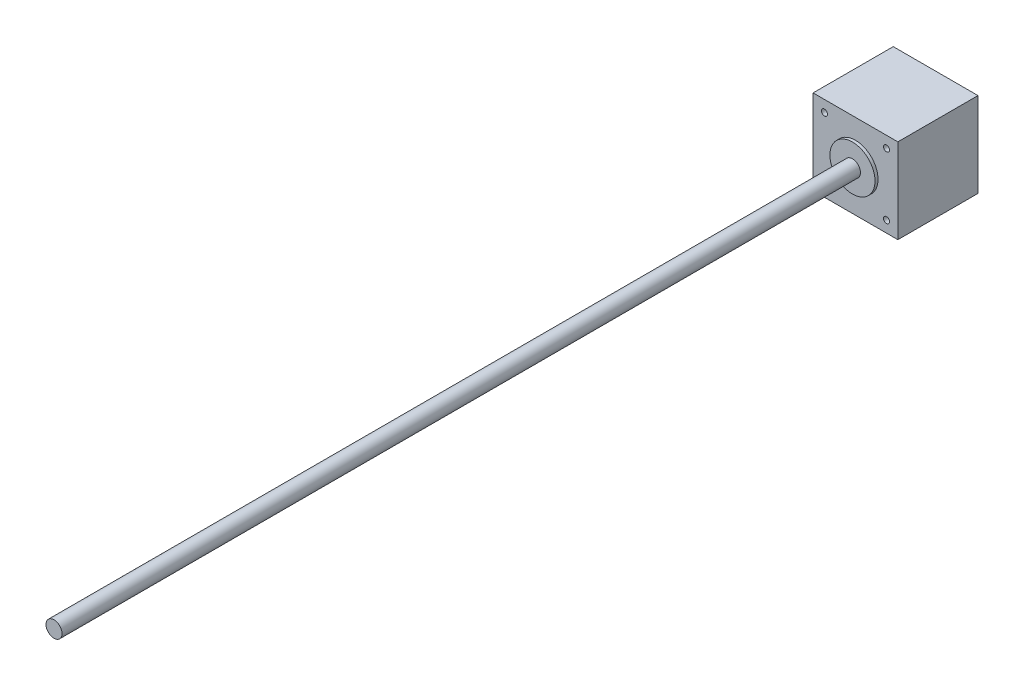
ISO-10303-21;
HEADER;
FILE_DESCRIPTION(('STEP AP214'),'2;1');
FILE_NAME('part.step','',(''),(''),'','','');
FILE_SCHEMA(('AUTOMOTIVE_DESIGN { 1 0 10303 214 1 1 1 1 }'));
ENDSEC;
DATA;
#1=APPLICATION_CONTEXT('core data for automotive mechanical design processes');
#2=APPLICATION_PROTOCOL_DEFINITION('international standard','automotive_design',2000,#1);
#3=PRODUCT_CONTEXT('',#1,'mechanical');
#4=PRODUCT('Part','Part','',(#3));
#5=PRODUCT_RELATED_PRODUCT_CATEGORY('part','',(#4));
#6=PRODUCT_DEFINITION_FORMATION('','',#4);
#7=PRODUCT_DEFINITION_CONTEXT('part definition',#1,'design');
#8=PRODUCT_DEFINITION('design','',#6,#7);
#9=PRODUCT_DEFINITION_SHAPE('','',#8);
#10=(LENGTH_UNIT() NAMED_UNIT(*) SI_UNIT(.MILLI.,.METRE.));
#11=(NAMED_UNIT(*) PLANE_ANGLE_UNIT() SI_UNIT($,.RADIAN.));
#12=(NAMED_UNIT(*) SI_UNIT($,.STERADIAN.) SOLID_ANGLE_UNIT());
#13=UNCERTAINTY_MEASURE_WITH_UNIT(LENGTH_MEASURE(1.E-05),#10,'distance_accuracy_value','');
#14=(GEOMETRIC_REPRESENTATION_CONTEXT(3) GLOBAL_UNCERTAINTY_ASSIGNED_CONTEXT((#13)) GLOBAL_UNIT_ASSIGNED_CONTEXT((#10,
#11,#12)) REPRESENTATION_CONTEXT('',''));
#15=CARTESIAN_POINT('',(0.,0.,0.));
#16=DIRECTION('',(0.,0.,1.));
#17=DIRECTION('',(1.,0.,0.));
#18=AXIS2_PLACEMENT_3D('',#15,#16,#17);
#19=CARTESIAN_POINT('',(-21.15,-21.15,-40.));
#20=DIRECTION('',(0.,-1.,0.));
#21=DIRECTION('',(0.,0.,-1.));
#22=AXIS2_PLACEMENT_3D('',#19,#20,#21);
#23=PLANE('',#22);
#24=DIRECTION('',(0.,0.,-1.));
#25=VECTOR('',#24,1.);
#26=CARTESIAN_POINT('',(-8.5,-21.15,-40.));
#27=LINE('',#26,#25);
#28=CARTESIAN_POINT('',(-8.5,-21.15,-31.));
#29=VERTEX_POINT('',#28);
#30=CARTESIAN_POINT('',(-8.5,-21.15,-40.));
#31=VERTEX_POINT('',#30);
#32=EDGE_CURVE('E49',#29,#31,#27,.T.);
#33=ORIENTED_EDGE('',*,*,#32,.F.);
#34=DIRECTION('',(-1.,0.,0.));
#35=VECTOR('',#34,1.);
#36=CARTESIAN_POINT('',(-8.5,-21.15,-31.));
#37=LINE('',#36,#35);
#38=CARTESIAN_POINT('',(8.5,-21.15,-31.));
#39=VERTEX_POINT('',#38);
#40=EDGE_CURVE('E117',#39,#29,#37,.T.);
#41=ORIENTED_EDGE('',*,*,#40,.F.);
#42=DIRECTION('',(0.,0.,1.));
#43=VECTOR('',#42,1.);
#44=CARTESIAN_POINT('',(8.50000000000001,-21.15,-40.));
#45=LINE('',#44,#43);
#46=CARTESIAN_POINT('',(8.50000000000001,-21.15,-40.));
#47=VERTEX_POINT('',#46);
#48=EDGE_CURVE('E55',#47,#39,#45,.T.);
#49=ORIENTED_EDGE('',*,*,#48,.F.);
#50=DIRECTION('',(1.,0.,0.));
#51=VECTOR('',#50,1.);
#52=CARTESIAN_POINT('',(-21.15,-21.15,-40.));
#53=LINE('',#52,#51);
#54=CARTESIAN_POINT('',(21.15,-21.15,-40.));
#55=VERTEX_POINT('',#54);
#56=EDGE_CURVE('E165',#47,#55,#53,.T.);
#57=ORIENTED_EDGE('',*,*,#56,.T.);
#58=DIRECTION('',(0.,0.,1.));
#59=VECTOR('',#58,1.);
#60=CARTESIAN_POINT('',(21.15,-21.15,-40.));
#61=LINE('',#60,#59);
#62=CARTESIAN_POINT('',(21.15,-21.15,0.));
#63=VERTEX_POINT('',#62);
#64=EDGE_CURVE('E36',#55,#63,#61,.T.);
#65=ORIENTED_EDGE('',*,*,#64,.T.);
#66=DIRECTION('',(1.,0.,0.));
#67=VECTOR('',#66,1.);
#68=CARTESIAN_POINT('',(-21.15,-21.15,0.));
#69=LINE('',#68,#67);
#70=CARTESIAN_POINT('',(-21.15,-21.15,0.));
#71=VERTEX_POINT('',#70);
#72=EDGE_CURVE('E159',#71,#63,#69,.T.);
#73=ORIENTED_EDGE('',*,*,#72,.F.);
#74=DIRECTION('',(0.,0.,1.));
#75=VECTOR('',#74,1.);
#76=CARTESIAN_POINT('',(-21.15,-21.15,-40.));
#77=LINE('',#76,#75);
#78=CARTESIAN_POINT('',(-21.15,-21.15,-40.));
#79=VERTEX_POINT('',#78);
#80=EDGE_CURVE('E11',#79,#71,#77,.T.);
#81=ORIENTED_EDGE('',*,*,#80,.F.);
#82=EDGE_CURVE('E162',#79,#31,#53,.T.);
#83=ORIENTED_EDGE('',*,*,#82,.T.);
#84=EDGE_LOOP('',(#33,#41,#49,#57,#65,#73,#81,#83));
#85=FACE_BOUND('',#84,.T.);
#86=ADVANCED_FACE('F33',(#85),#23,.T.);
#87=CARTESIAN_POINT('',(-21.15,-21.15,-40.));
#88=DIRECTION('',(1.,0.,0.));
#89=DIRECTION('',(0.,0.,-1.));
#90=AXIS2_PLACEMENT_3D('',#87,#88,#89);
#91=PLANE('',#90);
#92=DIRECTION('',(0.,1.,0.));
#93=VECTOR('',#92,1.);
#94=CARTESIAN_POINT('',(-21.15,-21.15,0.));
#95=LINE('',#94,#93);
#96=CARTESIAN_POINT('',(-21.15,21.15,0.));
#97=VERTEX_POINT('',#96);
#98=EDGE_CURVE('E180',#71,#97,#95,.T.);
#99=ORIENTED_EDGE('',*,*,#98,.T.);
#100=DIRECTION('',(0.,0.,1.));
#101=VECTOR('',#100,1.);
#102=CARTESIAN_POINT('',(-21.15,21.15,-40.));
#103=LINE('',#102,#101);
#104=CARTESIAN_POINT('',(-21.15,21.15,-40.));
#105=VERTEX_POINT('',#104);
#106=EDGE_CURVE('E41',#105,#97,#103,.T.);
#107=ORIENTED_EDGE('',*,*,#106,.F.);
#108=DIRECTION('',(0.,1.,0.));
#109=VECTOR('',#108,1.);
#110=CARTESIAN_POINT('',(-21.15,-21.15,-40.));
#111=LINE('',#110,#109);
#112=EDGE_CURVE('E170',#79,#105,#111,.T.);
#113=ORIENTED_EDGE('',*,*,#112,.F.);
#114=ORIENTED_EDGE('',*,*,#80,.T.);
#115=EDGE_LOOP('',(#99,#107,#113,#114));
#116=FACE_BOUND('',#115,.T.);
#117=ADVANCED_FACE('F197',(#116),#91,.F.);
#118=CARTESIAN_POINT('',(-21.15,21.15,-40.));
#119=DIRECTION('',(0.,-1.,0.));
#120=DIRECTION('',(0.,0.,-1.));
#121=AXIS2_PLACEMENT_3D('',#118,#119,#120);
#122=PLANE('',#121);
#123=DIRECTION('',(1.,0.,0.));
#124=VECTOR('',#123,1.);
#125=CARTESIAN_POINT('',(-21.15,21.15,0.));
#126=LINE('',#125,#124);
#127=CARTESIAN_POINT('',(21.15,21.15,0.));
#128=VERTEX_POINT('',#127);
#129=EDGE_CURVE('E177',#97,#128,#126,.T.);
#130=ORIENTED_EDGE('',*,*,#129,.T.);
#131=DIRECTION('',(0.,0.,1.));
#132=VECTOR('',#131,1.);
#133=CARTESIAN_POINT('',(21.15,21.15,-40.));
#134=LINE('',#133,#132);
#135=CARTESIAN_POINT('',(21.15,21.15,-40.));
#136=VERTEX_POINT('',#135);
#137=EDGE_CURVE('E183',#136,#128,#134,.T.);
#138=ORIENTED_EDGE('',*,*,#137,.F.);
#139=DIRECTION('',(1.,0.,0.));
#140=VECTOR('',#139,1.);
#141=CARTESIAN_POINT('',(-21.15,21.15,-40.));
#142=LINE('',#141,#140);
#143=EDGE_CURVE('E168',#105,#136,#142,.T.);
#144=ORIENTED_EDGE('',*,*,#143,.F.);
#145=ORIENTED_EDGE('',*,*,#106,.T.);
#146=EDGE_LOOP('',(#130,#138,#144,#145));
#147=FACE_BOUND('',#146,.T.);
#148=ADVANCED_FACE('F201',(#147),#122,.F.);
#149=CARTESIAN_POINT('',(21.15,-21.15,-40.));
#150=DIRECTION('',(1.,0.,0.));
#151=DIRECTION('',(0.,0.,-1.));
#152=AXIS2_PLACEMENT_3D('',#149,#150,#151);
#153=PLANE('',#152);
#154=DIRECTION('',(0.,1.,0.));
#155=VECTOR('',#154,1.);
#156=CARTESIAN_POINT('',(21.15,-21.15,0.));
#157=LINE('',#156,#155);
#158=EDGE_CURVE('E174',#63,#128,#157,.T.);
#159=ORIENTED_EDGE('',*,*,#158,.F.);
#160=ORIENTED_EDGE('',*,*,#64,.F.);
#161=DIRECTION('',(0.,1.,0.));
#162=VECTOR('',#161,1.);
#163=CARTESIAN_POINT('',(21.15,-21.15,-40.));
#164=LINE('',#163,#162);
#165=EDGE_CURVE('E164',#55,#136,#164,.T.);
#166=ORIENTED_EDGE('',*,*,#165,.T.);
#167=ORIENTED_EDGE('',*,*,#137,.T.);
#168=EDGE_LOOP('',(#159,#160,#166,#167));
#169=FACE_BOUND('',#168,.T.);
#170=ADVANCED_FACE('F190',(#169),#153,.T.);
#171=CARTESIAN_POINT('',(0.,0.,-40.));
#172=DIRECTION('',(0.,0.,1.));
#173=DIRECTION('',(1.,0.,0.));
#174=AXIS2_PLACEMENT_3D('',#171,#172,#173);
#175=PLANE('',#174);
#176=ORIENTED_EDGE('',*,*,#82,.F.);
#177=ORIENTED_EDGE('',*,*,#112,.T.);
#178=ORIENTED_EDGE('',*,*,#143,.T.);
#179=ORIENTED_EDGE('',*,*,#165,.F.);
#180=ORIENTED_EDGE('',*,*,#56,.F.);
#181=DIRECTION('',(0.,1.,0.));
#182=VECTOR('',#181,1.);
#183=CARTESIAN_POINT('',(8.50000000000001,-26.15,-40.));
#184=LINE('',#183,#182);
#185=CARTESIAN_POINT('',(8.50000000000001,-26.15,-40.));
#186=VERTEX_POINT('',#185);
#187=EDGE_CURVE('E104',#186,#47,#184,.T.);
#188=ORIENTED_EDGE('',*,*,#187,.F.);
#189=DIRECTION('',(1.,0.,0.));
#190=VECTOR('',#189,1.);
#191=CARTESIAN_POINT('',(-8.5,-26.15,-40.));
#192=LINE('',#191,#190);
#193=CARTESIAN_POINT('',(-8.5,-26.15,-40.));
#194=VERTEX_POINT('',#193);
#195=EDGE_CURVE('E97',#194,#186,#192,.T.);
#196=ORIENTED_EDGE('',*,*,#195,.F.);
#197=DIRECTION('',(0.,1.,0.));
#198=VECTOR('',#197,1.);
#199=CARTESIAN_POINT('',(-8.5,-26.15,-40.));
#200=LINE('',#199,#198);
#201=EDGE_CURVE('E102',#194,#31,#200,.T.);
#202=ORIENTED_EDGE('',*,*,#201,.T.);
#203=EDGE_LOOP('',(#176,#177,#178,#179,#180,#188,#196,#202));
#204=FACE_BOUND('',#203,.T.);
#205=ADVANCED_FACE('F100',(#204),#175,.F.);
#206=CARTESIAN_POINT('',(0.,0.,0.));
#207=DIRECTION('',(0.,0.,1.));
#208=DIRECTION('',(1.,0.,0.));
#209=AXIS2_PLACEMENT_3D('',#206,#207,#208);
#210=PLANE('',#209);
#211=CARTESIAN_POINT('',(0.,0.,0.));
#212=DIRECTION('',(0.,0.,1.));
#213=DIRECTION('',(1.,0.,0.));
#214=AXIS2_PLACEMENT_3D('',#211,#212,#213);
#215=CIRCLE('',#214,11.25);
#216=CARTESIAN_POINT('',(11.25,0.,0.));
#217=VERTEX_POINT('',#216);
#218=EDGE_CURVE('E123',#217,#217,#215,.T.);
#219=ORIENTED_EDGE('',*,*,#218,.F.);
#220=EDGE_LOOP('',(#219));
#221=FACE_BOUND('',#220,.T.);
#222=CARTESIAN_POINT('',(-15.5000000000001,15.5,0.));
#223=DIRECTION('',(0.,0.,1.));
#224=DIRECTION('',(1.,0.,0.));
#225=AXIS2_PLACEMENT_3D('',#222,#223,#224);
#226=CIRCLE('',#225,1.5);
#227=CARTESIAN_POINT('',(-14.0000000000001,15.5,0.));
#228=VERTEX_POINT('',#227);
#229=EDGE_CURVE('E151',#228,#228,#226,.T.);
#230=ORIENTED_EDGE('',*,*,#229,.F.);
#231=EDGE_LOOP('',(#230));
#232=FACE_BOUND('',#231,.T.);
#233=CARTESIAN_POINT('',(15.5,-15.5,0.));
#234=DIRECTION('',(0.,0.,1.));
#235=DIRECTION('',(1.,0.,0.));
#236=AXIS2_PLACEMENT_3D('',#233,#234,#235);
#237=CIRCLE('',#236,1.5);
#238=CARTESIAN_POINT('',(17.,-15.5,0.));
#239=VERTEX_POINT('',#238);
#240=EDGE_CURVE('E145',#239,#239,#237,.T.);
#241=ORIENTED_EDGE('',*,*,#240,.F.);
#242=EDGE_LOOP('',(#241));
#243=FACE_BOUND('',#242,.T.);
#244=CARTESIAN_POINT('',(15.5,15.5,0.));
#245=DIRECTION('',(0.,0.,1.));
#246=DIRECTION('',(1.,0.,0.));
#247=AXIS2_PLACEMENT_3D('',#244,#245,#246);
#248=CIRCLE('',#247,1.5);
#249=CARTESIAN_POINT('',(17.,15.5,0.));
#250=VERTEX_POINT('',#249);
#251=EDGE_CURVE('E138',#250,#250,#248,.T.);
#252=ORIENTED_EDGE('',*,*,#251,.F.);
#253=EDGE_LOOP('',(#252));
#254=FACE_BOUND('',#253,.T.);
#255=CARTESIAN_POINT('',(-15.5000000000001,-15.5000000000001,0.));
#256=DIRECTION('',(0.,0.,1.));
#257=DIRECTION('',(1.,0.,0.));
#258=AXIS2_PLACEMENT_3D('',#255,#256,#257);
#259=CIRCLE('',#258,1.5);
#260=CARTESIAN_POINT('',(-14.0000000000001,-15.5000000000001,0.));
#261=VERTEX_POINT('',#260);
#262=EDGE_CURVE('E141',#261,#261,#259,.T.);
#263=ORIENTED_EDGE('',*,*,#262,.F.);
#264=EDGE_LOOP('',(#263));
#265=FACE_BOUND('',#264,.T.);
#266=ORIENTED_EDGE('',*,*,#72,.T.);
#267=ORIENTED_EDGE('',*,*,#158,.T.);
#268=ORIENTED_EDGE('',*,*,#129,.F.);
#269=ORIENTED_EDGE('',*,*,#98,.F.);
#270=EDGE_LOOP('',(#266,#267,#268,#269));
#271=FACE_BOUND('',#270,.T.);
#272=ADVANCED_FACE('F194',(#221,#232,#243,#254,#265,#271),#210,.T.);
#273=CARTESIAN_POINT('',(-15.5000000000001,-15.5000000000001,-5.));
#274=DIRECTION('',(0.,0.,1.));
#275=DIRECTION('',(1.,0.,0.));
#276=AXIS2_PLACEMENT_3D('',#273,#274,#275);
#277=CYLINDRICAL_SURFACE('',#276,1.5);
#278=CARTESIAN_POINT('',(-15.5000000000001,-15.5000000000001,-5.));
#279=DIRECTION('',(0.,0.,1.));
#280=DIRECTION('',(1.,0.,0.));
#281=AXIS2_PLACEMENT_3D('',#278,#279,#280);
#282=CIRCLE('',#281,1.5);
#283=CARTESIAN_POINT('',(-14.0000000000001,-15.5000000000001,-5.));
#284=VERTEX_POINT('',#283);
#285=EDGE_CURVE('E156',#284,#284,#282,.T.);
#286=ORIENTED_EDGE('',*,*,#285,.F.);
#287=EDGE_LOOP('',(#286));
#288=FACE_BOUND('',#287,.T.);
#289=ORIENTED_EDGE('',*,*,#262,.T.);
#290=EDGE_LOOP('',(#289));
#291=FACE_BOUND('',#290,.T.);
#292=ADVANCED_FACE('F241',(#288,#291),#277,.F.);
#293=CARTESIAN_POINT('',(0.,0.,-5.));
#294=DIRECTION('',(0.,0.,1.));
#295=DIRECTION('',(1.,0.,0.));
#296=AXIS2_PLACEMENT_3D('',#293,#294,#295);
#297=PLANE('',#296);
#298=ORIENTED_EDGE('',*,*,#285,.T.);
#299=EDGE_LOOP('',(#298));
#300=FACE_BOUND('',#299,.T.);
#301=ADVANCED_FACE('F246',(#300),#297,.T.);
#302=CARTESIAN_POINT('',(15.5,15.5,-5.));
#303=DIRECTION('',(0.,0.,1.));
#304=DIRECTION('',(1.,0.,0.));
#305=AXIS2_PLACEMENT_3D('',#302,#303,#304);
#306=CYLINDRICAL_SURFACE('',#305,1.5);
#307=CARTESIAN_POINT('',(15.5,15.5,-5.));
#308=DIRECTION('',(0.,0.,1.));
#309=DIRECTION('',(1.,0.,0.));
#310=AXIS2_PLACEMENT_3D('',#307,#308,#309);
#311=CIRCLE('',#310,1.5);
#312=CARTESIAN_POINT('',(17.,15.5,-5.));
#313=VERTEX_POINT('',#312);
#314=EDGE_CURVE('E142',#313,#313,#311,.T.);
#315=ORIENTED_EDGE('',*,*,#314,.F.);
#316=EDGE_LOOP('',(#315));
#317=FACE_BOUND('',#316,.T.);
#318=ORIENTED_EDGE('',*,*,#251,.T.);
#319=EDGE_LOOP('',(#318));
#320=FACE_BOUND('',#319,.T.);
#321=ADVANCED_FACE('F250',(#317,#320),#306,.F.);
#322=CARTESIAN_POINT('',(0.,0.,-5.));
#323=DIRECTION('',(0.,0.,1.));
#324=DIRECTION('',(1.,0.,0.));
#325=AXIS2_PLACEMENT_3D('',#322,#323,#324);
#326=PLANE('',#325);
#327=ORIENTED_EDGE('',*,*,#314,.T.);
#328=EDGE_LOOP('',(#327));
#329=FACE_BOUND('',#328,.T.);
#330=ADVANCED_FACE('F268',(#329),#326,.T.);
#331=CARTESIAN_POINT('',(15.5,-15.5,-5.));
#332=DIRECTION('',(0.,0.,1.));
#333=DIRECTION('',(1.,0.,0.));
#334=AXIS2_PLACEMENT_3D('',#331,#332,#333);
#335=CYLINDRICAL_SURFACE('',#334,1.5);
#336=CARTESIAN_POINT('',(15.5,-15.5,-5.));
#337=DIRECTION('',(0.,0.,1.));
#338=DIRECTION('',(1.,0.,0.));
#339=AXIS2_PLACEMENT_3D('',#336,#337,#338);
#340=CIRCLE('',#339,1.5);
#341=CARTESIAN_POINT('',(17.,-15.5,-5.));
#342=VERTEX_POINT('',#341);
#343=EDGE_CURVE('E148',#342,#342,#340,.T.);
#344=ORIENTED_EDGE('',*,*,#343,.F.);
#345=EDGE_LOOP('',(#344));
#346=FACE_BOUND('',#345,.T.);
#347=ORIENTED_EDGE('',*,*,#240,.T.);
#348=EDGE_LOOP('',(#347));
#349=FACE_BOUND('',#348,.T.);
#350=ADVANCED_FACE('F264',(#346,#349),#335,.F.);
#351=CARTESIAN_POINT('',(0.,0.,-5.));
#352=DIRECTION('',(0.,0.,1.));
#353=DIRECTION('',(1.,0.,0.));
#354=AXIS2_PLACEMENT_3D('',#351,#352,#353);
#355=PLANE('',#354);
#356=ORIENTED_EDGE('',*,*,#343,.T.);
#357=EDGE_LOOP('',(#356));
#358=FACE_BOUND('',#357,.T.);
#359=ADVANCED_FACE('F260',(#358),#355,.T.);
#360=CARTESIAN_POINT('',(-15.5000000000001,15.5,-5.));
#361=DIRECTION('',(0.,0.,1.));
#362=DIRECTION('',(1.,0.,0.));
#363=AXIS2_PLACEMENT_3D('',#360,#361,#362);
#364=CYLINDRICAL_SURFACE('',#363,1.5);
#365=CARTESIAN_POINT('',(-15.5000000000001,15.5,-5.));
#366=DIRECTION('',(0.,0.,1.));
#367=DIRECTION('',(1.,0.,0.));
#368=AXIS2_PLACEMENT_3D('',#365,#366,#367);
#369=CIRCLE('',#368,1.5);
#370=CARTESIAN_POINT('',(-14.0000000000001,15.5,-5.));
#371=VERTEX_POINT('',#370);
#372=EDGE_CURVE('E135',#371,#371,#369,.T.);
#373=ORIENTED_EDGE('',*,*,#372,.F.);
#374=EDGE_LOOP('',(#373));
#375=FACE_BOUND('',#374,.T.);
#376=ORIENTED_EDGE('',*,*,#229,.T.);
#377=EDGE_LOOP('',(#376));
#378=FACE_BOUND('',#377,.T.);
#379=ADVANCED_FACE('F256',(#375,#378),#364,.F.);
#380=CARTESIAN_POINT('',(-15.5000000000001,15.5,-5.));
#381=DIRECTION('',(0.,0.,1.));
#382=DIRECTION('',(1.,0.,0.));
#383=AXIS2_PLACEMENT_3D('',#380,#381,#382);
#384=PLANE('',#383);
#385=ORIENTED_EDGE('',*,*,#372,.T.);
#386=EDGE_LOOP('',(#385));
#387=FACE_BOUND('',#386,.T.);
#388=ADVANCED_FACE('F252',(#387),#384,.T.);
#389=CARTESIAN_POINT('',(0.,0.,1.5));
#390=DIRECTION('',(0.,0.,-1.));
#391=DIRECTION('',(-1.,0.,0.));
#392=AXIS2_PLACEMENT_3D('',#389,#390,#391);
#393=CYLINDRICAL_SURFACE('',#392,11.25);
#394=CARTESIAN_POINT('',(0.,0.,1.5));
#395=DIRECTION('',(0.,0.,1.));
#396=DIRECTION('',(1.,0.,0.));
#397=AXIS2_PLACEMENT_3D('',#394,#395,#396);
#398=CIRCLE('',#397,11.25);
#399=CARTESIAN_POINT('',(11.25,0.,1.5));
#400=VERTEX_POINT('',#399);
#401=EDGE_CURVE('E132',#400,#400,#398,.T.);
#402=ORIENTED_EDGE('',*,*,#401,.F.);
#403=EDGE_LOOP('',(#402));
#404=FACE_BOUND('',#403,.T.);
#405=ORIENTED_EDGE('',*,*,#218,.T.);
#406=EDGE_LOOP('',(#405));
#407=FACE_BOUND('',#406,.T.);
#408=ADVANCED_FACE('F255',(#404,#407),#393,.T.);
#409=CARTESIAN_POINT('',(0.,0.,1.5));
#410=DIRECTION('',(0.,0.,1.));
#411=DIRECTION('',(1.,0.,0.));
#412=AXIS2_PLACEMENT_3D('',#409,#410,#411);
#413=PLANE('',#412);
#414=CARTESIAN_POINT('',(0.,0.,1.5));
#415=DIRECTION('',(0.,0.,1.));
#416=DIRECTION('',(1.,0.,0.));
#417=AXIS2_PLACEMENT_3D('',#414,#415,#416);
#418=CIRCLE('',#417,4.);
#419=CARTESIAN_POINT('',(4.,0.,1.5));
#420=VERTEX_POINT('',#419);
#421=EDGE_CURVE('E129',#420,#420,#418,.T.);
#422=ORIENTED_EDGE('',*,*,#421,.F.);
#423=EDGE_LOOP('',(#422));
#424=FACE_BOUND('',#423,.T.);
#425=ORIENTED_EDGE('',*,*,#401,.T.);
#426=EDGE_LOOP('',(#425));
#427=FACE_BOUND('',#426,.T.);
#428=ADVANCED_FACE('F278',(#424,#427),#413,.T.);
#429=CARTESIAN_POINT('',(0.,0.,400.));
#430=DIRECTION('',(0.,0.,-1.));
#431=DIRECTION('',(-1.,0.,0.));
#432=AXIS2_PLACEMENT_3D('',#429,#430,#431);
#433=CYLINDRICAL_SURFACE('',#432,4.);
#434=ORIENTED_EDGE('',*,*,#421,.T.);
#435=EDGE_LOOP('',(#434));
#436=FACE_BOUND('',#435,.T.);
#437=CARTESIAN_POINT('',(0.,0.,400.));
#438=DIRECTION('',(0.,0.,1.));
#439=DIRECTION('',(1.,0.,0.));
#440=AXIS2_PLACEMENT_3D('',#437,#438,#439);
#441=CIRCLE('',#440,4.);
#442=CARTESIAN_POINT('',(4.,0.,400.));
#443=VERTEX_POINT('',#442);
#444=EDGE_CURVE('E120',#443,#443,#441,.T.);
#445=ORIENTED_EDGE('',*,*,#444,.F.);
#446=EDGE_LOOP('',(#445));
#447=FACE_BOUND('',#446,.T.);
#448=ADVANCED_FACE('F282',(#436,#447),#433,.T.);
#449=CARTESIAN_POINT('',(0.,0.,400.));
#450=DIRECTION('',(0.,0.,1.));
#451=DIRECTION('',(1.,0.,0.));
#452=AXIS2_PLACEMENT_3D('',#449,#450,#451);
#453=PLANE('',#452);
#454=ORIENTED_EDGE('',*,*,#444,.T.);
#455=EDGE_LOOP('',(#454));
#456=FACE_BOUND('',#455,.T.);
#457=ADVANCED_FACE('F286',(#456),#453,.T.);
#458=CARTESIAN_POINT('',(-8.5,-26.15,-40.));
#459=DIRECTION('',(1.,0.,0.));
#460=DIRECTION('',(0.,0.,-1.));
#461=AXIS2_PLACEMENT_3D('',#458,#459,#460);
#462=PLANE('',#461);
#463=ORIENTED_EDGE('',*,*,#32,.T.);
#464=ORIENTED_EDGE('',*,*,#201,.F.);
#465=DIRECTION('',(0.,0.,-1.));
#466=VECTOR('',#465,1.);
#467=CARTESIAN_POINT('',(-8.5,-26.15,-40.));
#468=LINE('',#467,#466);
#469=CARTESIAN_POINT('',(-8.5,-26.15,-31.));
#470=VERTEX_POINT('',#469);
#471=EDGE_CURVE('E108',#470,#194,#468,.T.);
#472=ORIENTED_EDGE('',*,*,#471,.F.);
#473=DIRECTION('',(0.,1.,0.));
#474=VECTOR('',#473,1.);
#475=CARTESIAN_POINT('',(-8.5,-26.15,-31.));
#476=LINE('',#475,#474);
#477=EDGE_CURVE('E207',#470,#29,#476,.T.);
#478=ORIENTED_EDGE('',*,*,#477,.T.);
#479=EDGE_LOOP('',(#463,#464,#472,#478));
#480=FACE_BOUND('',#479,.T.);
#481=ADVANCED_FACE('F119',(#480),#462,.F.);
#482=CARTESIAN_POINT('',(8.50000000000001,-26.15,-40.));
#483=DIRECTION('',(-1.,0.,0.));
#484=DIRECTION('',(0.,0.,1.));
#485=AXIS2_PLACEMENT_3D('',#482,#483,#484);
#486=PLANE('',#485);
#487=ORIENTED_EDGE('',*,*,#48,.T.);
#488=DIRECTION('',(0.,1.,0.));
#489=VECTOR('',#488,1.);
#490=CARTESIAN_POINT('',(8.5,-26.15,-31.));
#491=LINE('',#490,#489);
#492=CARTESIAN_POINT('',(8.5,-26.15,-31.));
#493=VERTEX_POINT('',#492);
#494=EDGE_CURVE('E125',#493,#39,#491,.T.);
#495=ORIENTED_EDGE('',*,*,#494,.F.);
#496=DIRECTION('',(0.,0.,1.));
#497=VECTOR('',#496,1.);
#498=CARTESIAN_POINT('',(8.50000000000001,-26.15,-40.));
#499=LINE('',#498,#497);
#500=EDGE_CURVE('E107',#186,#493,#499,.T.);
#501=ORIENTED_EDGE('',*,*,#500,.F.);
#502=ORIENTED_EDGE('',*,*,#187,.T.);
#503=EDGE_LOOP('',(#487,#495,#501,#502));
#504=FACE_BOUND('',#503,.T.);
#505=ADVANCED_FACE('F203',(#504),#486,.F.);
#506=CARTESIAN_POINT('',(-8.5,-26.15,-31.));
#507=DIRECTION('',(0.,0.,-1.));
#508=DIRECTION('',(-1.,0.,0.));
#509=AXIS2_PLACEMENT_3D('',#506,#507,#508);
#510=PLANE('',#509);
#511=ORIENTED_EDGE('',*,*,#40,.T.);
#512=ORIENTED_EDGE('',*,*,#477,.F.);
#513=DIRECTION('',(-1.,0.,0.));
#514=VECTOR('',#513,1.);
#515=CARTESIAN_POINT('',(-8.5,-26.15,-31.));
#516=LINE('',#515,#514);
#517=EDGE_CURVE('E113',#493,#470,#516,.T.);
#518=ORIENTED_EDGE('',*,*,#517,.F.);
#519=ORIENTED_EDGE('',*,*,#494,.T.);
#520=EDGE_LOOP('',(#511,#512,#518,#519));
#521=FACE_BOUND('',#520,.T.);
#522=ADVANCED_FACE('F214',(#521),#510,.F.);
#523=CARTESIAN_POINT('',(0.,-26.15,0.));
#524=DIRECTION('',(0.,1.,0.));
#525=DIRECTION('',(0.,0.,1.));
#526=AXIS2_PLACEMENT_3D('',#523,#524,#525);
#527=PLANE('',#526);
#528=ORIENTED_EDGE('',*,*,#471,.T.);
#529=ORIENTED_EDGE('',*,*,#195,.T.);
#530=ORIENTED_EDGE('',*,*,#500,.T.);
#531=ORIENTED_EDGE('',*,*,#517,.T.);
#532=EDGE_LOOP('',(#528,#529,#530,#531));
#533=FACE_BOUND('',#532,.T.);
#534=ADVANCED_FACE('F111',(#533),#527,.F.);
#535=CLOSED_SHELL('',(#86,#117,#148,#170,#205,#272,#292,#301,#321,#330,#350,#359,#379,#388,#408,
#428,#448,#457,#481,#505,#522,#534));
#536=MANIFOLD_SOLID_BREP('B2',#535);
#537=ADVANCED_BREP_SHAPE_REPRESENTATION('',(#18,#536),#14);
#538=SHAPE_DEFINITION_REPRESENTATION(#9,#537);
ENDSEC;
END-ISO-10303-21;
